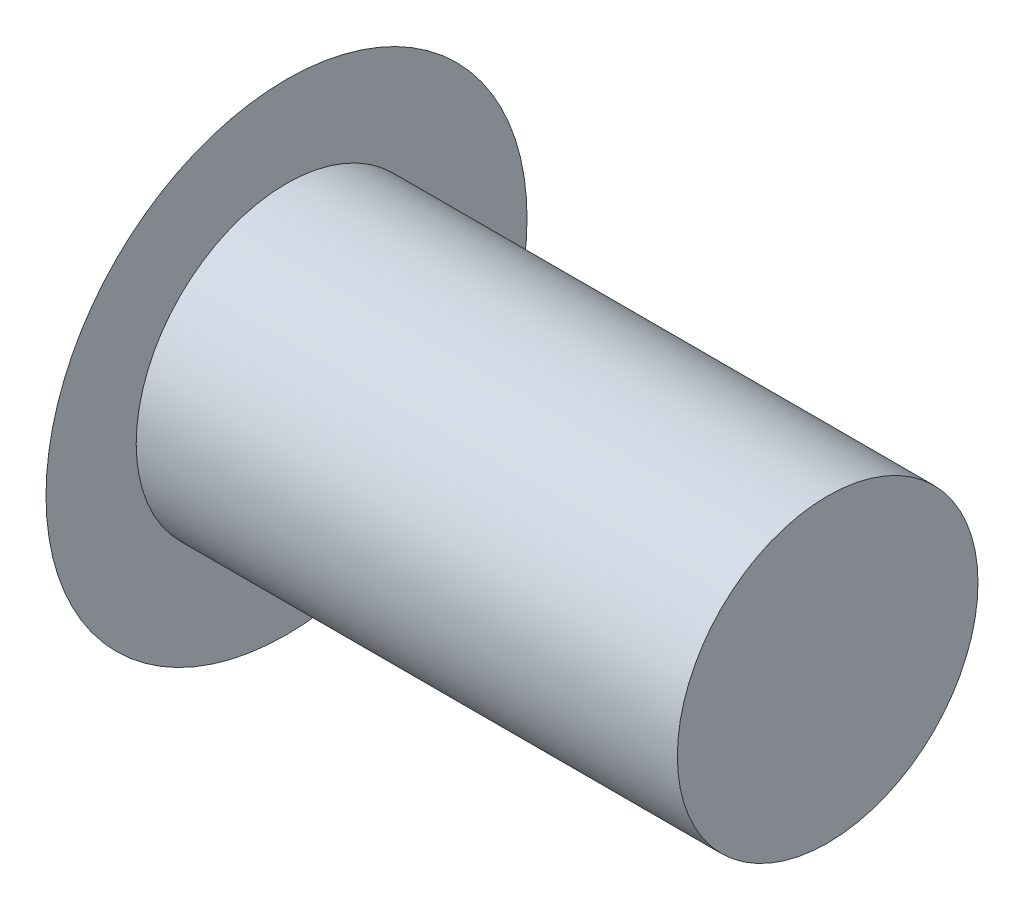
ISO-10303-21;
HEADER;
FILE_DESCRIPTION(('STEP AP214'),'2;1');
FILE_NAME('part.step','',(''),(''),'','','');
FILE_SCHEMA(('AUTOMOTIVE_DESIGN { 1 0 10303 214 1 1 1 1 }'));
ENDSEC;
DATA;
#1=APPLICATION_CONTEXT('core data for automotive mechanical design processes');
#2=APPLICATION_PROTOCOL_DEFINITION('international standard','automotive_design',2000,#1);
#3=PRODUCT_CONTEXT('',#1,'mechanical');
#4=PRODUCT('Part','Part','',(#3));
#5=PRODUCT_RELATED_PRODUCT_CATEGORY('part','',(#4));
#6=PRODUCT_DEFINITION_FORMATION('','',#4);
#7=PRODUCT_DEFINITION_CONTEXT('part definition',#1,'design');
#8=PRODUCT_DEFINITION('design','',#6,#7);
#9=PRODUCT_DEFINITION_SHAPE('','',#8);
#10=(LENGTH_UNIT() NAMED_UNIT(*) SI_UNIT(.MILLI.,.METRE.));
#11=(NAMED_UNIT(*) PLANE_ANGLE_UNIT() SI_UNIT($,.RADIAN.));
#12=(NAMED_UNIT(*) SI_UNIT($,.STERADIAN.) SOLID_ANGLE_UNIT());
#13=UNCERTAINTY_MEASURE_WITH_UNIT(LENGTH_MEASURE(1.E-05),#10,'distance_accuracy_value','');
#14=(GEOMETRIC_REPRESENTATION_CONTEXT(3) GLOBAL_UNCERTAINTY_ASSIGNED_CONTEXT((#13)) GLOBAL_UNIT_ASSIGNED_CONTEXT((#10,
#11,#12)) REPRESENTATION_CONTEXT('',''));
#15=CARTESIAN_POINT('',(0.,0.,0.));
#16=DIRECTION('',(0.,0.,1.));
#17=DIRECTION('',(1.,0.,0.));
#18=AXIS2_PLACEMENT_3D('',#15,#16,#17);
#19=CARTESIAN_POINT('',(18.,0.,0.));
#20=DIRECTION('',(-1.,0.,0.));
#21=DIRECTION('',(0.,0.,1.));
#22=AXIS2_PLACEMENT_3D('',#19,#20,#21);
#23=CYLINDRICAL_SURFACE('',#22,5.);
#24=CARTESIAN_POINT('',(18.,0.,0.));
#25=DIRECTION('',(1.,0.,0.));
#26=DIRECTION('',(0.,0.,-1.));
#27=AXIS2_PLACEMENT_3D('',#24,#25,#26);
#28=CIRCLE('',#27,5.);
#29=CARTESIAN_POINT('',(18.,0.,-5.));
#30=VERTEX_POINT('',#29);
#31=EDGE_CURVE('E151',#30,#30,#28,.T.);
#32=ORIENTED_EDGE('',*,*,#31,.F.);
#33=EDGE_LOOP('',(#32));
#34=FACE_BOUND('',#33,.T.);
#35=CARTESIAN_POINT('',(0.,0.,0.));
#36=DIRECTION('',(1.,0.,0.));
#37=DIRECTION('',(0.,0.,-1.));
#38=AXIS2_PLACEMENT_3D('',#35,#36,#37);
#39=CIRCLE('',#38,5.);
#40=CARTESIAN_POINT('',(0.,0.,-5.));
#41=VERTEX_POINT('',#40);
#42=EDGE_CURVE('E150',#41,#41,#39,.T.);
#43=ORIENTED_EDGE('',*,*,#42,.T.);
#44=EDGE_LOOP('',(#43));
#45=FACE_BOUND('',#44,.T.);
#46=ADVANCED_FACE('F33',(#34,#45),#23,.T.);
#47=CARTESIAN_POINT('',(18.,0.,0.));
#48=DIRECTION('',(1.,0.,0.));
#49=DIRECTION('',(0.,0.,-1.));
#50=AXIS2_PLACEMENT_3D('',#47,#48,#49);
#51=PLANE('',#50);
#52=ORIENTED_EDGE('',*,*,#31,.T.);
#53=EDGE_LOOP('',(#52));
#54=FACE_BOUND('',#53,.T.);
#55=ADVANCED_FACE('F239',(#54),#51,.T.);
#56=CARTESIAN_POINT('',(0.,0.,0.));
#57=DIRECTION('',(1.,0.,0.));
#58=DIRECTION('',(0.,0.,1.));
#59=AXIS2_PLACEMENT_3D('',#56,#57,#58);
#60=CONICAL_SURFACE('',#59,8.,1.0471975511966);
#61=CARTESIAN_POINT('',(-3.,0.,0.));
#62=DIRECTION('',(-1.,0.,0.));
#63=DIRECTION('',(0.,0.,1.));
#64=AXIS2_PLACEMENT_3D('',#61,#62,#63);
#65=CIRCLE('',#64,2.80384757729334);
#66=CARTESIAN_POINT('',(-3.,0.,2.80384757729334));
#67=VERTEX_POINT('',#66);
#68=EDGE_CURVE('E147',#67,#67,#65,.T.);
#69=ORIENTED_EDGE('',*,*,#68,.F.);
#70=EDGE_LOOP('',(#69));
#71=FACE_BOUND('',#70,.T.);
#72=CARTESIAN_POINT('',(0.,0.,0.));
#73=DIRECTION('',(-1.,0.,0.));
#74=DIRECTION('',(0.,0.,1.));
#75=AXIS2_PLACEMENT_3D('',#72,#73,#74);
#76=CIRCLE('',#75,8.);
#77=CARTESIAN_POINT('',(0.,0.,8.));
#78=VERTEX_POINT('',#77);
#79=EDGE_CURVE('E138',#78,#78,#76,.T.);
#80=ORIENTED_EDGE('',*,*,#79,.T.);
#81=EDGE_LOOP('',(#80));
#82=FACE_BOUND('',#81,.T.);
#83=ADVANCED_FACE('F245',(#71,#82),#60,.T.);
#84=CARTESIAN_POINT('',(-3.,0.,0.));
#85=DIRECTION('',(-1.,0.,0.));
#86=DIRECTION('',(0.,0.,1.));
#87=AXIS2_PLACEMENT_3D('',#84,#85,#86);
#88=PLANE('',#87);
#89=DIRECTION('',(0.,0.866025403784442,0.499999999999995));
#90=VECTOR('',#89,1.);
#91=CARTESIAN_POINT('',(-3.,-2.0272207608513,1.17041645198432));
#92=LINE('',#91,#90);
#93=CARTESIAN_POINT('',(-3.,-2.0272207608513,1.17041645198432));
#94=VERTEX_POINT('',#93);
#95=CARTESIAN_POINT('',(-3.,0.,2.3408329039686));
#96=VERTEX_POINT('',#95);
#97=EDGE_CURVE('E119',#94,#96,#92,.T.);
#98=ORIENTED_EDGE('',*,*,#97,.F.);
#99=DIRECTION('',(0.,0.,1.));
#100=VECTOR('',#99,1.);
#101=CARTESIAN_POINT('',(-3.,-2.02722076085132,-1.17041645198428));
#102=LINE('',#101,#100);
#103=CARTESIAN_POINT('',(-3.,-2.02722076085132,-1.17041645198428));
#104=VERTEX_POINT('',#103);
#105=EDGE_CURVE('E133',#104,#94,#102,.T.);
#106=ORIENTED_EDGE('',*,*,#105,.F.);
#107=DIRECTION('',(0.,-0.866025403784434,0.500000000000007));
#108=VECTOR('',#107,1.);
#109=CARTESIAN_POINT('',(-3.,0.,-2.3408329039686));
#110=LINE('',#109,#108);
#111=CARTESIAN_POINT('',(-3.,0.,-2.3408329039686));
#112=VERTEX_POINT('',#111);
#113=EDGE_CURVE('E127',#112,#104,#110,.T.);
#114=ORIENTED_EDGE('',*,*,#113,.F.);
#115=DIRECTION('',(0.,-0.866025403784442,-0.499999999999995));
#116=VECTOR('',#115,1.);
#117=CARTESIAN_POINT('',(-3.,2.0272207608513,-1.17041645198431));
#118=LINE('',#117,#116);
#119=CARTESIAN_POINT('',(-3.,2.0272207608513,-1.17041645198431));
#120=VERTEX_POINT('',#119);
#121=EDGE_CURVE('E125',#120,#112,#118,.T.);
#122=ORIENTED_EDGE('',*,*,#121,.F.);
#123=DIRECTION('',(0.,0.,-1.));
#124=VECTOR('',#123,1.);
#125=CARTESIAN_POINT('',(-3.,2.02722076085131,1.1704164519843));
#126=LINE('',#125,#124);
#127=CARTESIAN_POINT('',(-3.,2.02722076085131,1.1704164519843));
#128=VERTEX_POINT('',#127);
#129=EDGE_CURVE('E107',#128,#120,#126,.T.);
#130=ORIENTED_EDGE('',*,*,#129,.F.);
#131=DIRECTION('',(0.,0.866025403784438,-0.500000000000001));
#132=VECTOR('',#131,1.);
#133=CARTESIAN_POINT('',(-3.,0.,2.3408329039686));
#134=LINE('',#133,#132);
#135=EDGE_CURVE('E114',#96,#128,#134,.T.);
#136=ORIENTED_EDGE('',*,*,#135,.F.);
#137=EDGE_LOOP('',(#98,#106,#114,#122,#130,#136));
#138=FACE_BOUND('',#137,.T.);
#139=ORIENTED_EDGE('',*,*,#68,.T.);
#140=EDGE_LOOP('',(#139));
#141=FACE_BOUND('',#140,.T.);
#142=ADVANCED_FACE('F121',(#138,#141),#88,.T.);
#143=CARTESIAN_POINT('',(0.,0.,0.));
#144=DIRECTION('',(-1.,0.,0.));
#145=DIRECTION('',(0.,0.,1.));
#146=AXIS2_PLACEMENT_3D('',#143,#144,#145);
#147=PLANE('',#146);
#148=ORIENTED_EDGE('',*,*,#42,.F.);
#149=EDGE_LOOP('',(#148));
#150=FACE_BOUND('',#149,.T.);
#151=ORIENTED_EDGE('',*,*,#79,.F.);
#152=EDGE_LOOP('',(#151));
#153=FACE_BOUND('',#152,.T.);
#154=ADVANCED_FACE('F338',(#150,#153),#147,.F.);
#155=CARTESIAN_POINT('',(-2.,-2.0272207608513,1.17041645198432));
#156=DIRECTION('',(0.,-0.499999999999995,0.866025403784441));
#157=DIRECTION('',(0.,-0.866025403784442,-0.499999999999995));
#158=AXIS2_PLACEMENT_3D('',#155,#156,#157);
#159=PLANE('',#158);
#160=DIRECTION('',(-1.,0.,0.));
#161=VECTOR('',#160,1.);
#162=CARTESIAN_POINT('',(-2.,0.,2.3408329039686));
#163=LINE('',#162,#161);
#164=CARTESIAN_POINT('',(-2.5,0.,2.3408329039686));
#165=VERTEX_POINT('',#164);
#166=EDGE_CURVE('E111',#165,#96,#163,.T.);
#167=ORIENTED_EDGE('',*,*,#166,.F.);
#168=DIRECTION('',(0.,0.866025403784442,0.499999999999995));
#169=VECTOR('',#168,1.);
#170=CARTESIAN_POINT('',(-2.5,-2.0272207608513,1.17041645198432));
#171=LINE('',#170,#169);
#172=CARTESIAN_POINT('',(-2.5,-2.0272207608513,1.17041645198432));
#173=VERTEX_POINT('',#172);
#174=EDGE_CURVE('E11',#165,#173,#171,.F.);
#175=ORIENTED_EDGE('',*,*,#174,.T.);
#176=DIRECTION('',(-1.,0.,0.));
#177=VECTOR('',#176,1.);
#178=CARTESIAN_POINT('',(-2.,-2.0272207608513,1.17041645198432));
#179=LINE('',#178,#177);
#180=EDGE_CURVE('E136',#173,#94,#179,.T.);
#181=ORIENTED_EDGE('',*,*,#180,.T.);
#182=ORIENTED_EDGE('',*,*,#97,.T.);
#183=EDGE_LOOP('',(#167,#175,#181,#182));
#184=FACE_BOUND('',#183,.T.);
#185=ADVANCED_FACE('F197',(#184),#159,.F.);
#186=CARTESIAN_POINT('',(-2.,-2.02722076085132,-1.17041645198428));
#187=DIRECTION('',(0.,-1.,0.));
#188=DIRECTION('',(0.,0.,-1.));
#189=AXIS2_PLACEMENT_3D('',#186,#187,#188);
#190=PLANE('',#189);
#191=ORIENTED_EDGE('',*,*,#180,.F.);
#192=DIRECTION('',(0.,0.,1.));
#193=VECTOR('',#192,1.);
#194=CARTESIAN_POINT('',(-2.5,-2.02722076085132,-1.17041645198428));
#195=LINE('',#194,#193);
#196=CARTESIAN_POINT('',(-2.5,-2.02722076085132,-1.17041645198428));
#197=VERTEX_POINT('',#196);
#198=EDGE_CURVE('E169',#173,#197,#195,.F.);
#199=ORIENTED_EDGE('',*,*,#198,.T.);
#200=DIRECTION('',(-1.,0.,0.));
#201=VECTOR('',#200,1.);
#202=CARTESIAN_POINT('',(-2.,-2.02722076085132,-1.17041645198428));
#203=LINE('',#202,#201);
#204=EDGE_CURVE('E139',#197,#104,#203,.T.);
#205=ORIENTED_EDGE('',*,*,#204,.T.);
#206=ORIENTED_EDGE('',*,*,#105,.T.);
#207=EDGE_LOOP('',(#191,#199,#205,#206));
#208=FACE_BOUND('',#207,.T.);
#209=ADVANCED_FACE('F202',(#208),#190,.F.);
#210=CARTESIAN_POINT('',(-2.,0.,-2.3408329039686));
#211=DIRECTION('',(0.,-0.500000000000007,-0.866025403784435));
#212=DIRECTION('',(0.,0.866025403784434,-0.500000000000007));
#213=AXIS2_PLACEMENT_3D('',#210,#211,#212);
#214=PLANE('',#213);
#215=ORIENTED_EDGE('',*,*,#204,.F.);
#216=DIRECTION('',(0.,-0.866025403784434,0.500000000000007));
#217=VECTOR('',#216,1.);
#218=CARTESIAN_POINT('',(-2.5,0.,-2.3408329039686));
#219=LINE('',#218,#217);
#220=CARTESIAN_POINT('',(-2.5,0.,-2.3408329039686));
#221=VERTEX_POINT('',#220);
#222=EDGE_CURVE('E172',#197,#221,#219,.F.);
#223=ORIENTED_EDGE('',*,*,#222,.T.);
#224=DIRECTION('',(-1.,0.,0.));
#225=VECTOR('',#224,1.);
#226=CARTESIAN_POINT('',(-2.,0.,-2.3408329039686));
#227=LINE('',#226,#225);
#228=EDGE_CURVE('E141',#221,#112,#227,.T.);
#229=ORIENTED_EDGE('',*,*,#228,.T.);
#230=ORIENTED_EDGE('',*,*,#113,.T.);
#231=EDGE_LOOP('',(#215,#223,#229,#230));
#232=FACE_BOUND('',#231,.T.);
#233=ADVANCED_FACE('F206',(#232),#214,.F.);
#234=CARTESIAN_POINT('',(-2.,2.0272207608513,-1.17041645198431));
#235=DIRECTION('',(0.,0.499999999999995,-0.866025403784442));
#236=DIRECTION('',(0.,0.866025403784442,0.499999999999995));
#237=AXIS2_PLACEMENT_3D('',#234,#235,#236);
#238=PLANE('',#237);
#239=ORIENTED_EDGE('',*,*,#228,.F.);
#240=DIRECTION('',(0.,-0.866025403784442,-0.499999999999995));
#241=VECTOR('',#240,1.);
#242=CARTESIAN_POINT('',(-2.5,2.0272207608513,-1.17041645198431));
#243=LINE('',#242,#241);
#244=CARTESIAN_POINT('',(-2.5,2.0272207608513,-1.17041645198431));
#245=VERTEX_POINT('',#244);
#246=EDGE_CURVE('E174',#221,#245,#243,.F.);
#247=ORIENTED_EDGE('',*,*,#246,.T.);
#248=DIRECTION('',(-1.,0.,0.));
#249=VECTOR('',#248,1.);
#250=CARTESIAN_POINT('',(-2.,2.0272207608513,-1.17041645198431));
#251=LINE('',#250,#249);
#252=EDGE_CURVE('E110',#245,#120,#251,.T.);
#253=ORIENTED_EDGE('',*,*,#252,.T.);
#254=ORIENTED_EDGE('',*,*,#121,.T.);
#255=EDGE_LOOP('',(#239,#247,#253,#254));
#256=FACE_BOUND('',#255,.T.);
#257=ADVANCED_FACE('F210',(#256),#238,.F.);
#258=CARTESIAN_POINT('',(-2.,2.02722076085131,1.1704164519843));
#259=DIRECTION('',(0.,1.,0.));
#260=DIRECTION('',(0.,0.,1.));
#261=AXIS2_PLACEMENT_3D('',#258,#259,#260);
#262=PLANE('',#261);
#263=ORIENTED_EDGE('',*,*,#252,.F.);
#264=DIRECTION('',(0.,0.,-1.));
#265=VECTOR('',#264,1.);
#266=CARTESIAN_POINT('',(-2.5,2.02722076085131,1.1704164519843));
#267=LINE('',#266,#265);
#268=CARTESIAN_POINT('',(-2.5,2.02722076085131,1.1704164519843));
#269=VERTEX_POINT('',#268);
#270=EDGE_CURVE('E57',#245,#269,#267,.F.);
#271=ORIENTED_EDGE('',*,*,#270,.T.);
#272=DIRECTION('',(-1.,0.,0.));
#273=VECTOR('',#272,1.);
#274=CARTESIAN_POINT('',(-2.,2.02722076085131,1.1704164519843));
#275=LINE('',#274,#273);
#276=EDGE_CURVE('E103',#269,#128,#275,.T.);
#277=ORIENTED_EDGE('',*,*,#276,.T.);
#278=ORIENTED_EDGE('',*,*,#129,.T.);
#279=EDGE_LOOP('',(#263,#271,#277,#278));
#280=FACE_BOUND('',#279,.T.);
#281=ADVANCED_FACE('F105',(#280),#262,.F.);
#282=CARTESIAN_POINT('',(-2.,0.,2.3408329039686));
#283=DIRECTION('',(0.,0.500000000000001,0.866025403784438));
#284=DIRECTION('',(0.,-0.866025403784438,0.500000000000001));
#285=AXIS2_PLACEMENT_3D('',#282,#283,#284);
#286=PLANE('',#285);
#287=ORIENTED_EDGE('',*,*,#276,.F.);
#288=DIRECTION('',(0.,0.866025403784438,-0.500000000000001));
#289=VECTOR('',#288,1.);
#290=CARTESIAN_POINT('',(-2.5,0.,2.3408329039686));
#291=LINE('',#290,#289);
#292=EDGE_CURVE('E42',#269,#165,#291,.F.);
#293=ORIENTED_EDGE('',*,*,#292,.T.);
#294=ORIENTED_EDGE('',*,*,#166,.T.);
#295=ORIENTED_EDGE('',*,*,#135,.T.);
#296=EDGE_LOOP('',(#287,#293,#294,#295));
#297=FACE_BOUND('',#296,.T.);
#298=ADVANCED_FACE('F115',(#297),#286,.F.);
#299=CARTESIAN_POINT('',(-2.,0.,0.));
#300=DIRECTION('',(-1.,0.,0.));
#301=DIRECTION('',(0.,0.,1.));
#302=AXIS2_PLACEMENT_3D('',#299,#300,#301);
#303=PLANE('',#302);
#304=DIRECTION('',(0.,-0.866025403784434,0.500000000000007));
#305=VECTOR('',#304,1.);
#306=CARTESIAN_POINT('',(-2.,-0.763610380425664,-1.32261197608422));
#307=LINE('',#306,#305);
#308=CARTESIAN_POINT('',(-2.,0.,-1.76348263477898));
#309=VERTEX_POINT('',#308);
#310=CARTESIAN_POINT('',(-2.,-1.52722076085132,-0.881741317389473));
#311=VERTEX_POINT('',#310);
#312=EDGE_CURVE('E164',#309,#311,#307,.T.);
#313=ORIENTED_EDGE('',*,*,#312,.T.);
#314=DIRECTION('',(0.,0.,1.));
#315=VECTOR('',#314,1.);
#316=CARTESIAN_POINT('',(-2.,-1.52722076085131,0.));
#317=LINE('',#316,#315);
#318=CARTESIAN_POINT('',(-2.,-1.5272207608513,0.881741317389508));
#319=VERTEX_POINT('',#318);
#320=EDGE_CURVE('E166',#311,#319,#317,.T.);
#321=ORIENTED_EDGE('',*,*,#320,.T.);
#322=DIRECTION('',(0.,0.866025403784442,0.499999999999995));
#323=VECTOR('',#322,1.);
#324=CARTESIAN_POINT('',(-2.,-0.76361038042565,1.32261197608424));
#325=LINE('',#324,#323);
#326=CARTESIAN_POINT('',(-2.,0.,1.76348263477898));
#327=VERTEX_POINT('',#326);
#328=EDGE_CURVE('E154',#319,#327,#325,.T.);
#329=ORIENTED_EDGE('',*,*,#328,.T.);
#330=DIRECTION('',(0.,0.866025403784438,-0.500000000000001));
#331=VECTOR('',#330,1.);
#332=CARTESIAN_POINT('',(-2.,0.763610380425655,1.32261197608423));
#333=LINE('',#332,#331);
#334=CARTESIAN_POINT('',(-2.,1.52722076085131,0.881741317389485));
#335=VERTEX_POINT('',#334);
#336=EDGE_CURVE('E158',#327,#335,#333,.T.);
#337=ORIENTED_EDGE('',*,*,#336,.T.);
#338=DIRECTION('',(0.,0.,-1.));
#339=VECTOR('',#338,1.);
#340=CARTESIAN_POINT('',(-2.,1.52722076085131,0.));
#341=LINE('',#340,#339);
#342=CARTESIAN_POINT('',(-2.,1.5272207608513,-0.881741317389495));
#343=VERTEX_POINT('',#342);
#344=EDGE_CURVE('E160',#335,#343,#341,.T.);
#345=ORIENTED_EDGE('',*,*,#344,.T.);
#346=DIRECTION('',(0.,-0.866025403784442,-0.499999999999995));
#347=VECTOR('',#346,1.);
#348=CARTESIAN_POINT('',(-2.,0.763610380425645,-1.32261197608423));
#349=LINE('',#348,#347);
#350=EDGE_CURVE('E162',#343,#309,#349,.T.);
#351=ORIENTED_EDGE('',*,*,#350,.T.);
#352=EDGE_LOOP('',(#313,#321,#329,#337,#345,#351));
#353=FACE_BOUND('',#352,.T.);
#354=ADVANCED_FACE('F229',(#353),#303,.T.);
#355=CARTESIAN_POINT('',(-2.5,1.52722076085131,0.));
#356=DIRECTION('',(0.,0.,-1.));
#357=DIRECTION('',(0.,1.,0.));
#358=AXIS2_PLACEMENT_3D('',#355,#356,#357);
#359=CYLINDRICAL_SURFACE('',#358,0.5);
#360=CARTESIAN_POINT('',(-2.5,1.52722076085131,0.881741317389485));
#361=DIRECTION('',(0.,0.499999999999998,-0.86602540378444));
#362=DIRECTION('',(0.,-0.86602540378444,-0.499999999999998));
#363=AXIS2_PLACEMENT_3D('',#360,#361,#362);
#364=ELLIPSE('',#363,0.577350269189626,0.5);
#365=EDGE_CURVE('E187',#269,#335,#364,.T.);
#366=ORIENTED_EDGE('',*,*,#365,.F.);
#367=ORIENTED_EDGE('',*,*,#270,.F.);
#368=CARTESIAN_POINT('',(-2.5,1.5272207608513,-0.881741317389495));
#369=DIRECTION('',(0.,-0.500000000000004,-0.866025403784436));
#370=DIRECTION('',(0.,-0.866025403784436,0.500000000000004));
#371=AXIS2_PLACEMENT_3D('',#368,#369,#370);
#372=ELLIPSE('',#371,0.577350269189626,0.5);
#373=EDGE_CURVE('E37',#343,#245,#372,.F.);
#374=ORIENTED_EDGE('',*,*,#373,.F.);
#375=ORIENTED_EDGE('',*,*,#344,.F.);
#376=EDGE_LOOP('',(#366,#367,#374,#375));
#377=FACE_BOUND('',#376,.T.);
#378=ADVANCED_FACE('F35',(#377),#359,.F.);
#379=CARTESIAN_POINT('',(-2.5,0.763610380425646,-1.32261197608424));
#380=DIRECTION('',(0.,-0.866025403784442,-0.499999999999995));
#381=DIRECTION('',(0.,0.499999999999995,-0.866025403784442));
#382=AXIS2_PLACEMENT_3D('',#379,#380,#381);
#383=CYLINDRICAL_SURFACE('',#382,0.5);
#384=ORIENTED_EDGE('',*,*,#373,.T.);
#385=ORIENTED_EDGE('',*,*,#246,.F.);
#386=CARTESIAN_POINT('',(-2.5,0.,-1.76348263477898));
#387=DIRECTION('',(0.,-1.,0.));
#388=DIRECTION('',(0.,0.,1.));
#389=AXIS2_PLACEMENT_3D('',#386,#387,#388);
#390=ELLIPSE('',#389,0.577350269189626,0.5);
#391=EDGE_CURVE('E185',#309,#221,#390,.F.);
#392=ORIENTED_EDGE('',*,*,#391,.F.);
#393=ORIENTED_EDGE('',*,*,#350,.F.);
#394=EDGE_LOOP('',(#384,#385,#392,#393));
#395=FACE_BOUND('',#394,.T.);
#396=ADVANCED_FACE('F227',(#395),#383,.F.);
#397=CARTESIAN_POINT('',(-2.5,0.763610380425655,1.32261197608423));
#398=DIRECTION('',(0.,0.866025403784438,-0.500000000000001));
#399=DIRECTION('',(0.,0.500000000000001,0.866025403784438));
#400=AXIS2_PLACEMENT_3D('',#397,#398,#399);
#401=CYLINDRICAL_SURFACE('',#400,0.5);
#402=ORIENTED_EDGE('',*,*,#365,.T.);
#403=ORIENTED_EDGE('',*,*,#336,.F.);
#404=CARTESIAN_POINT('',(-2.5,0.,1.76348263477898));
#405=DIRECTION('',(0.,1.,0.));
#406=DIRECTION('',(0.,0.,-1.));
#407=AXIS2_PLACEMENT_3D('',#404,#405,#406);
#408=ELLIPSE('',#407,0.577350269189625,0.5);
#409=EDGE_CURVE('E182',#165,#327,#408,.T.);
#410=ORIENTED_EDGE('',*,*,#409,.F.);
#411=ORIENTED_EDGE('',*,*,#292,.F.);
#412=EDGE_LOOP('',(#402,#403,#410,#411));
#413=FACE_BOUND('',#412,.T.);
#414=ADVANCED_FACE('F213',(#413),#401,.F.);
#415=CARTESIAN_POINT('',(-2.5,-0.763610380425664,-1.32261197608422));
#416=DIRECTION('',(0.,-0.866025403784434,0.500000000000007));
#417=DIRECTION('',(0.,-0.500000000000007,-0.866025403784435));
#418=AXIS2_PLACEMENT_3D('',#415,#416,#417);
#419=CYLINDRICAL_SURFACE('',#418,0.5);
#420=ORIENTED_EDGE('',*,*,#391,.T.);
#421=ORIENTED_EDGE('',*,*,#222,.F.);
#422=CARTESIAN_POINT('',(-2.5,-1.52722076085132,-0.881741317389473));
#423=DIRECTION('',(0.,-0.499999999999992,0.866025403784443));
#424=DIRECTION('',(0.,0.866025403784443,0.499999999999992));
#425=AXIS2_PLACEMENT_3D('',#422,#423,#424);
#426=ELLIPSE('',#425,0.577350269189626,0.5);
#427=EDGE_CURVE('E180',#311,#197,#426,.F.);
#428=ORIENTED_EDGE('',*,*,#427,.F.);
#429=ORIENTED_EDGE('',*,*,#312,.F.);
#430=EDGE_LOOP('',(#420,#421,#428,#429));
#431=FACE_BOUND('',#430,.T.);
#432=ADVANCED_FACE('F225',(#431),#419,.F.);
#433=CARTESIAN_POINT('',(-2.5,-0.76361038042565,1.32261197608424));
#434=DIRECTION('',(0.,0.866025403784442,0.499999999999995));
#435=DIRECTION('',(0.,-0.499999999999995,0.866025403784441));
#436=AXIS2_PLACEMENT_3D('',#433,#434,#435);
#437=CYLINDRICAL_SURFACE('',#436,0.5);
#438=ORIENTED_EDGE('',*,*,#409,.T.);
#439=ORIENTED_EDGE('',*,*,#328,.F.);
#440=CARTESIAN_POINT('',(-2.5,-1.5272207608513,0.881741317389508));
#441=DIRECTION('',(0.,0.500000000000007,0.866025403784435));
#442=DIRECTION('',(0.,-0.866025403784435,0.500000000000007));
#443=AXIS2_PLACEMENT_3D('',#440,#441,#442);
#444=ELLIPSE('',#443,0.577350269189625,0.5);
#445=EDGE_CURVE('E178',#173,#319,#444,.T.);
#446=ORIENTED_EDGE('',*,*,#445,.F.);
#447=ORIENTED_EDGE('',*,*,#174,.F.);
#448=EDGE_LOOP('',(#438,#439,#446,#447));
#449=FACE_BOUND('',#448,.T.);
#450=ADVANCED_FACE('F218',(#449),#437,.F.);
#451=CARTESIAN_POINT('',(-2.5,-1.52722076085131,0.));
#452=DIRECTION('',(0.,0.,1.));
#453=DIRECTION('',(0.,-1.,0.));
#454=AXIS2_PLACEMENT_3D('',#451,#452,#453);
#455=CYLINDRICAL_SURFACE('',#454,0.5);
#456=ORIENTED_EDGE('',*,*,#427,.T.);
#457=ORIENTED_EDGE('',*,*,#198,.F.);
#458=ORIENTED_EDGE('',*,*,#445,.T.);
#459=ORIENTED_EDGE('',*,*,#320,.F.);
#460=EDGE_LOOP('',(#456,#457,#458,#459));
#461=FACE_BOUND('',#460,.T.);
#462=ADVANCED_FACE('F221',(#461),#455,.F.);
#463=CLOSED_SHELL('',(#46,#55,#83,#142,#154,#185,#209,#233,#257,#281,#298,#354,#378,#396,#414,
#432,#450,#462));
#464=MANIFOLD_SOLID_BREP('B2',#463);
#465=ADVANCED_BREP_SHAPE_REPRESENTATION('',(#18,#464),#14);
#466=SHAPE_DEFINITION_REPRESENTATION(#9,#465);
ENDSEC;
END-ISO-10303-21;
